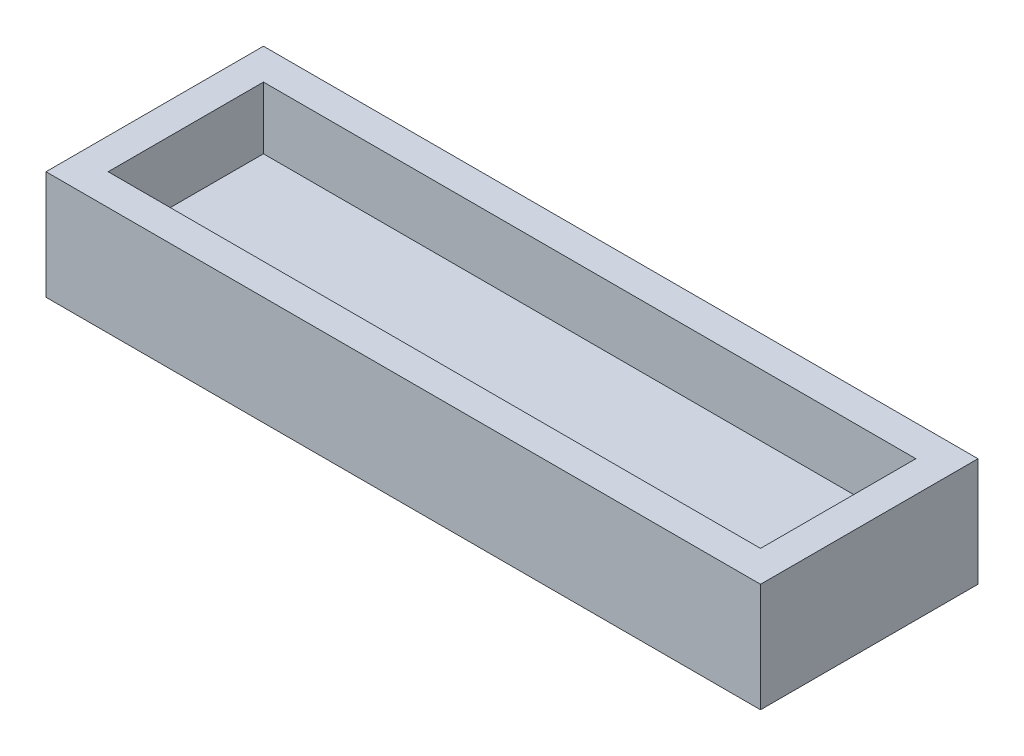
ISO-10303-21;
HEADER;
FILE_DESCRIPTION(('STEP AP214'),'2;1');
FILE_NAME('part.step','',(''),(''),'','','');
FILE_SCHEMA(('AUTOMOTIVE_DESIGN { 1 0 10303 214 1 1 1 1 }'));
ENDSEC;
DATA;
#1=APPLICATION_CONTEXT('core data for automotive mechanical design processes');
#2=APPLICATION_PROTOCOL_DEFINITION('international standard','automotive_design',2000,#1);
#3=PRODUCT_CONTEXT('',#1,'mechanical');
#4=PRODUCT('Part','Part','',(#3));
#5=PRODUCT_RELATED_PRODUCT_CATEGORY('part','',(#4));
#6=PRODUCT_DEFINITION_FORMATION('','',#4);
#7=PRODUCT_DEFINITION_CONTEXT('part definition',#1,'design');
#8=PRODUCT_DEFINITION('design','',#6,#7);
#9=PRODUCT_DEFINITION_SHAPE('','',#8);
#10=(LENGTH_UNIT() NAMED_UNIT(*) SI_UNIT(.MILLI.,.METRE.));
#11=(NAMED_UNIT(*) PLANE_ANGLE_UNIT() SI_UNIT($,.RADIAN.));
#12=(NAMED_UNIT(*) SI_UNIT($,.STERADIAN.) SOLID_ANGLE_UNIT());
#13=UNCERTAINTY_MEASURE_WITH_UNIT(LENGTH_MEASURE(1.E-05),#10,'distance_accuracy_value','');
#14=(GEOMETRIC_REPRESENTATION_CONTEXT(3) GLOBAL_UNCERTAINTY_ASSIGNED_CONTEXT((#13)) GLOBAL_UNIT_ASSIGNED_CONTEXT((#10,
#11,#12)) REPRESENTATION_CONTEXT('',''));
#15=CARTESIAN_POINT('',(0.,0.,0.));
#16=DIRECTION('',(0.,0.,1.));
#17=DIRECTION('',(1.,0.,0.));
#18=AXIS2_PLACEMENT_3D('',#15,#16,#17);
#19=CARTESIAN_POINT('',(0.,3.,0.));
#20=DIRECTION('',(0.,1.,0.));
#21=DIRECTION('',(0.,0.,1.));
#22=AXIS2_PLACEMENT_3D('',#19,#20,#21);
#23=PLANE('',#22);
#24=DIRECTION('',(0.,0.,-1.));
#25=VECTOR('',#24,1.);
#26=CARTESIAN_POINT('',(21.,3.,-5.));
#27=LINE('',#26,#25);
#28=CARTESIAN_POINT('',(21.,3.,5.));
#29=VERTEX_POINT('',#28);
#30=CARTESIAN_POINT('',(21.,3.,-5.));
#31=VERTEX_POINT('',#30);
#32=EDGE_CURVE('E147',#29,#31,#27,.T.);
#33=ORIENTED_EDGE('',*,*,#32,.T.);
#34=DIRECTION('',(-1.,0.,0.));
#35=VECTOR('',#34,1.);
#36=CARTESIAN_POINT('',(-21.,3.,-5.));
#37=LINE('',#36,#35);
#38=CARTESIAN_POINT('',(-21.,3.,-5.));
#39=VERTEX_POINT('',#38);
#40=EDGE_CURVE('E60',#31,#39,#37,.T.);
#41=ORIENTED_EDGE('',*,*,#40,.T.);
#42=DIRECTION('',(0.,0.,1.));
#43=VECTOR('',#42,1.);
#44=CARTESIAN_POINT('',(-21.,3.,-5.));
#45=LINE('',#44,#43);
#46=CARTESIAN_POINT('',(-21.,3.,5.));
#47=VERTEX_POINT('',#46);
#48=EDGE_CURVE('E45',#39,#47,#45,.T.);
#49=ORIENTED_EDGE('',*,*,#48,.T.);
#50=DIRECTION('',(1.,0.,0.));
#51=VECTOR('',#50,1.);
#52=CARTESIAN_POINT('',(-21.,3.,5.));
#53=LINE('',#52,#51);
#54=EDGE_CURVE('E12',#47,#29,#53,.T.);
#55=ORIENTED_EDGE('',*,*,#54,.T.);
#56=EDGE_LOOP('',(#33,#41,#49,#55));
#57=FACE_BOUND('',#56,.T.);
#58=ADVANCED_FACE('F37',(#57),#23,.T.);
#59=CARTESIAN_POINT('',(23.,59.0832611206852,-7.));
#60=DIRECTION('',(0.,0.,-1.));
#61=DIRECTION('',(-1.,0.,0.));
#62=AXIS2_PLACEMENT_3D('',#59,#60,#61);
#63=PLANE('',#62);
#64=DIRECTION('',(0.,-1.,0.));
#65=VECTOR('',#64,1.);
#66=CARTESIAN_POINT('',(-23.,59.0832611206852,-7.));
#67=LINE('',#66,#65);
#68=CARTESIAN_POINT('',(-23.,7.,-7.));
#69=VERTEX_POINT('',#68);
#70=CARTESIAN_POINT('',(-23.,0.,-7.));
#71=VERTEX_POINT('',#70);
#72=EDGE_CURVE('E115',#69,#71,#67,.T.);
#73=ORIENTED_EDGE('',*,*,#72,.F.);
#74=DIRECTION('',(1.,0.,0.));
#75=VECTOR('',#74,1.);
#76=CARTESIAN_POINT('',(23.,7.,-7.));
#77=LINE('',#76,#75);
#78=CARTESIAN_POINT('',(23.,7.,-7.));
#79=VERTEX_POINT('',#78);
#80=EDGE_CURVE('E148',#69,#79,#77,.T.);
#81=ORIENTED_EDGE('',*,*,#80,.T.);
#82=DIRECTION('',(0.,-1.,0.));
#83=VECTOR('',#82,1.);
#84=CARTESIAN_POINT('',(23.,59.0832611206852,-7.));
#85=LINE('',#84,#83);
#86=CARTESIAN_POINT('',(23.,0.,-7.));
#87=VERTEX_POINT('',#86);
#88=EDGE_CURVE('E129',#79,#87,#85,.T.);
#89=ORIENTED_EDGE('',*,*,#88,.T.);
#90=DIRECTION('',(1.,0.,0.));
#91=VECTOR('',#90,1.);
#92=CARTESIAN_POINT('',(23.,0.,-7.));
#93=LINE('',#92,#91);
#94=EDGE_CURVE('E134',#71,#87,#93,.T.);
#95=ORIENTED_EDGE('',*,*,#94,.F.);
#96=EDGE_LOOP('',(#73,#81,#89,#95));
#97=FACE_BOUND('',#96,.T.);
#98=ADVANCED_FACE('F182',(#97),#63,.T.);
#99=CARTESIAN_POINT('',(-23.,59.0832611206852,-7.));
#100=DIRECTION('',(-1.,0.,0.));
#101=DIRECTION('',(0.,0.,1.));
#102=AXIS2_PLACEMENT_3D('',#99,#100,#101);
#103=PLANE('',#102);
#104=DIRECTION('',(0.,-1.,0.));
#105=VECTOR('',#104,1.);
#106=CARTESIAN_POINT('',(-23.,59.0832611206852,7.));
#107=LINE('',#106,#105);
#108=CARTESIAN_POINT('',(-23.,7.,7.));
#109=VERTEX_POINT('',#108);
#110=CARTESIAN_POINT('',(-23.,0.,7.));
#111=VERTEX_POINT('',#110);
#112=EDGE_CURVE('E114',#109,#111,#107,.T.);
#113=ORIENTED_EDGE('',*,*,#112,.F.);
#114=DIRECTION('',(0.,0.,-1.));
#115=VECTOR('',#114,1.);
#116=CARTESIAN_POINT('',(-23.,7.,-7.));
#117=LINE('',#116,#115);
#118=EDGE_CURVE('E111',#109,#69,#117,.T.);
#119=ORIENTED_EDGE('',*,*,#118,.T.);
#120=ORIENTED_EDGE('',*,*,#72,.T.);
#121=DIRECTION('',(0.,0.,-1.));
#122=VECTOR('',#121,1.);
#123=CARTESIAN_POINT('',(-23.,0.,-7.));
#124=LINE('',#123,#122);
#125=EDGE_CURVE('E143',#111,#71,#124,.T.);
#126=ORIENTED_EDGE('',*,*,#125,.F.);
#127=EDGE_LOOP('',(#113,#119,#120,#126));
#128=FACE_BOUND('',#127,.T.);
#129=ADVANCED_FACE('F186',(#128),#103,.T.);
#130=CARTESIAN_POINT('',(23.,59.0832611206852,7.));
#131=DIRECTION('',(0.,0.,1.));
#132=DIRECTION('',(1.,0.,0.));
#133=AXIS2_PLACEMENT_3D('',#130,#131,#132);
#134=PLANE('',#133);
#135=DIRECTION('',(0.,-1.,0.));
#136=VECTOR('',#135,1.);
#137=CARTESIAN_POINT('',(23.,59.0832611206852,7.));
#138=LINE('',#137,#136);
#139=CARTESIAN_POINT('',(23.,7.,7.));
#140=VERTEX_POINT('',#139);
#141=CARTESIAN_POINT('',(23.,0.,7.));
#142=VERTEX_POINT('',#141);
#143=EDGE_CURVE('E118',#140,#142,#138,.T.);
#144=ORIENTED_EDGE('',*,*,#143,.F.);
#145=DIRECTION('',(-1.,0.,0.));
#146=VECTOR('',#145,1.);
#147=CARTESIAN_POINT('',(23.,7.,7.));
#148=LINE('',#147,#146);
#149=EDGE_CURVE('E103',#140,#109,#148,.T.);
#150=ORIENTED_EDGE('',*,*,#149,.T.);
#151=ORIENTED_EDGE('',*,*,#112,.T.);
#152=DIRECTION('',(-1.,0.,0.));
#153=VECTOR('',#152,1.);
#154=CARTESIAN_POINT('',(23.,0.,7.));
#155=LINE('',#154,#153);
#156=EDGE_CURVE('E121',#142,#111,#155,.T.);
#157=ORIENTED_EDGE('',*,*,#156,.F.);
#158=EDGE_LOOP('',(#144,#150,#151,#157));
#159=FACE_BOUND('',#158,.T.);
#160=ADVANCED_FACE('F119',(#159),#134,.T.);
#161=CARTESIAN_POINT('',(23.,59.0832611206852,-7.));
#162=DIRECTION('',(1.,0.,0.));
#163=DIRECTION('',(0.,0.,-1.));
#164=AXIS2_PLACEMENT_3D('',#161,#162,#163);
#165=PLANE('',#164);
#166=ORIENTED_EDGE('',*,*,#88,.F.);
#167=DIRECTION('',(0.,0.,1.));
#168=VECTOR('',#167,1.);
#169=CARTESIAN_POINT('',(23.,7.,-7.));
#170=LINE('',#169,#168);
#171=EDGE_CURVE('E108',#79,#140,#170,.T.);
#172=ORIENTED_EDGE('',*,*,#171,.T.);
#173=ORIENTED_EDGE('',*,*,#143,.T.);
#174=DIRECTION('',(0.,0.,1.));
#175=VECTOR('',#174,1.);
#176=CARTESIAN_POINT('',(23.,0.,-7.));
#177=LINE('',#176,#175);
#178=EDGE_CURVE('E270',#87,#142,#177,.T.);
#179=ORIENTED_EDGE('',*,*,#178,.F.);
#180=EDGE_LOOP('',(#166,#172,#173,#179));
#181=FACE_BOUND('',#180,.T.);
#182=ADVANCED_FACE('F128',(#181),#165,.T.);
#183=CARTESIAN_POINT('',(21.,59.0832611206852,-5.));
#184=DIRECTION('',(1.,0.,0.));
#185=DIRECTION('',(0.,0.,-1.));
#186=AXIS2_PLACEMENT_3D('',#183,#184,#185);
#187=PLANE('',#186);
#188=ORIENTED_EDGE('',*,*,#32,.F.);
#189=DIRECTION('',(0.,-1.,0.));
#190=VECTOR('',#189,1.);
#191=CARTESIAN_POINT('',(21.,59.0832611206852,5.));
#192=LINE('',#191,#190);
#193=CARTESIAN_POINT('',(21.,7.,5.));
#194=VERTEX_POINT('',#193);
#195=EDGE_CURVE('E52',#194,#29,#192,.T.);
#196=ORIENTED_EDGE('',*,*,#195,.F.);
#197=DIRECTION('',(0.,0.,1.));
#198=VECTOR('',#197,1.);
#199=CARTESIAN_POINT('',(21.,7.,-5.));
#200=LINE('',#199,#198);
#201=CARTESIAN_POINT('',(21.,7.,-5.));
#202=VERTEX_POINT('',#201);
#203=EDGE_CURVE('E136',#202,#194,#200,.T.);
#204=ORIENTED_EDGE('',*,*,#203,.F.);
#205=DIRECTION('',(0.,-1.,0.));
#206=VECTOR('',#205,1.);
#207=CARTESIAN_POINT('',(21.,59.0832611206852,-5.));
#208=LINE('',#207,#206);
#209=EDGE_CURVE('E125',#202,#31,#208,.T.);
#210=ORIENTED_EDGE('',*,*,#209,.T.);
#211=EDGE_LOOP('',(#188,#196,#204,#210));
#212=FACE_BOUND('',#211,.T.);
#213=ADVANCED_FACE('F189',(#212),#187,.F.);
#214=CARTESIAN_POINT('',(21.,59.0832611206852,-5.));
#215=DIRECTION('',(0.,0.,-1.));
#216=DIRECTION('',(-1.,0.,0.));
#217=AXIS2_PLACEMENT_3D('',#214,#215,#216);
#218=PLANE('',#217);
#219=ORIENTED_EDGE('',*,*,#40,.F.);
#220=ORIENTED_EDGE('',*,*,#209,.F.);
#221=DIRECTION('',(1.,0.,0.));
#222=VECTOR('',#221,1.);
#223=CARTESIAN_POINT('',(21.,7.,-5.));
#224=LINE('',#223,#222);
#225=CARTESIAN_POINT('',(-21.,7.,-5.));
#226=VERTEX_POINT('',#225);
#227=EDGE_CURVE('E140',#226,#202,#224,.T.);
#228=ORIENTED_EDGE('',*,*,#227,.F.);
#229=DIRECTION('',(0.,-1.,0.));
#230=VECTOR('',#229,1.);
#231=CARTESIAN_POINT('',(-21.,59.0832611206852,-5.));
#232=LINE('',#231,#230);
#233=EDGE_CURVE('E156',#226,#39,#232,.T.);
#234=ORIENTED_EDGE('',*,*,#233,.T.);
#235=EDGE_LOOP('',(#219,#220,#228,#234));
#236=FACE_BOUND('',#235,.T.);
#237=ADVANCED_FACE('F170',(#236),#218,.F.);
#238=CARTESIAN_POINT('',(-21.,59.0832611206852,-5.));
#239=DIRECTION('',(-1.,0.,0.));
#240=DIRECTION('',(0.,0.,1.));
#241=AXIS2_PLACEMENT_3D('',#238,#239,#240);
#242=PLANE('',#241);
#243=ORIENTED_EDGE('',*,*,#48,.F.);
#244=ORIENTED_EDGE('',*,*,#233,.F.);
#245=DIRECTION('',(0.,0.,-1.));
#246=VECTOR('',#245,1.);
#247=CARTESIAN_POINT('',(-21.,7.,-5.));
#248=LINE('',#247,#246);
#249=CARTESIAN_POINT('',(-21.,7.,5.));
#250=VERTEX_POINT('',#249);
#251=EDGE_CURVE('E144',#250,#226,#248,.T.);
#252=ORIENTED_EDGE('',*,*,#251,.F.);
#253=DIRECTION('',(0.,-1.,0.));
#254=VECTOR('',#253,1.);
#255=CARTESIAN_POINT('',(-21.,59.0832611206852,5.));
#256=LINE('',#255,#254);
#257=EDGE_CURVE('E158',#250,#47,#256,.T.);
#258=ORIENTED_EDGE('',*,*,#257,.T.);
#259=EDGE_LOOP('',(#243,#244,#252,#258));
#260=FACE_BOUND('',#259,.T.);
#261=ADVANCED_FACE('F168',(#260),#242,.F.);
#262=CARTESIAN_POINT('',(21.,59.0832611206852,5.));
#263=DIRECTION('',(0.,0.,1.));
#264=DIRECTION('',(1.,0.,0.));
#265=AXIS2_PLACEMENT_3D('',#262,#263,#264);
#266=PLANE('',#265);
#267=ORIENTED_EDGE('',*,*,#54,.F.);
#268=ORIENTED_EDGE('',*,*,#257,.F.);
#269=DIRECTION('',(-1.,0.,0.));
#270=VECTOR('',#269,1.);
#271=CARTESIAN_POINT('',(21.,7.,5.));
#272=LINE('',#271,#270);
#273=EDGE_CURVE('E139',#194,#250,#272,.T.);
#274=ORIENTED_EDGE('',*,*,#273,.F.);
#275=ORIENTED_EDGE('',*,*,#195,.T.);
#276=EDGE_LOOP('',(#267,#268,#274,#275));
#277=FACE_BOUND('',#276,.T.);
#278=ADVANCED_FACE('F171',(#277),#266,.F.);
#279=CARTESIAN_POINT('',(0.,7.,0.));
#280=DIRECTION('',(0.,1.,0.));
#281=DIRECTION('',(0.,0.,1.));
#282=AXIS2_PLACEMENT_3D('',#279,#280,#281);
#283=PLANE('',#282);
#284=ORIENTED_EDGE('',*,*,#80,.F.);
#285=ORIENTED_EDGE('',*,*,#118,.F.);
#286=ORIENTED_EDGE('',*,*,#149,.F.);
#287=ORIENTED_EDGE('',*,*,#171,.F.);
#288=EDGE_LOOP('',(#284,#285,#286,#287));
#289=FACE_BOUND('',#288,.T.);
#290=ORIENTED_EDGE('',*,*,#227,.T.);
#291=ORIENTED_EDGE('',*,*,#203,.T.);
#292=ORIENTED_EDGE('',*,*,#273,.T.);
#293=ORIENTED_EDGE('',*,*,#251,.T.);
#294=EDGE_LOOP('',(#290,#291,#292,#293));
#295=FACE_BOUND('',#294,.T.);
#296=ADVANCED_FACE('F105',(#289,#295),#283,.T.);
#297=CARTESIAN_POINT('',(0.,0.,0.));
#298=DIRECTION('',(0.,1.,0.));
#299=DIRECTION('',(0.,0.,1.));
#300=AXIS2_PLACEMENT_3D('',#297,#298,#299);
#301=PLANE('',#300);
#302=ORIENTED_EDGE('',*,*,#94,.T.);
#303=ORIENTED_EDGE('',*,*,#178,.T.);
#304=ORIENTED_EDGE('',*,*,#156,.T.);
#305=ORIENTED_EDGE('',*,*,#125,.T.);
#306=EDGE_LOOP('',(#302,#303,#304,#305));
#307=FACE_BOUND('',#306,.T.);
#308=ADVANCED_FACE('F39',(#307),#301,.F.);
#309=CLOSED_SHELL('',(#58,#98,#129,#160,#182,#213,#237,#261,#278,#296,#308));
#310=MANIFOLD_SOLID_BREP('B2',#309);
#311=ADVANCED_BREP_SHAPE_REPRESENTATION('',(#18,#310),#14);
#312=SHAPE_DEFINITION_REPRESENTATION(#9,#311);
ENDSEC;
END-ISO-10303-21;
